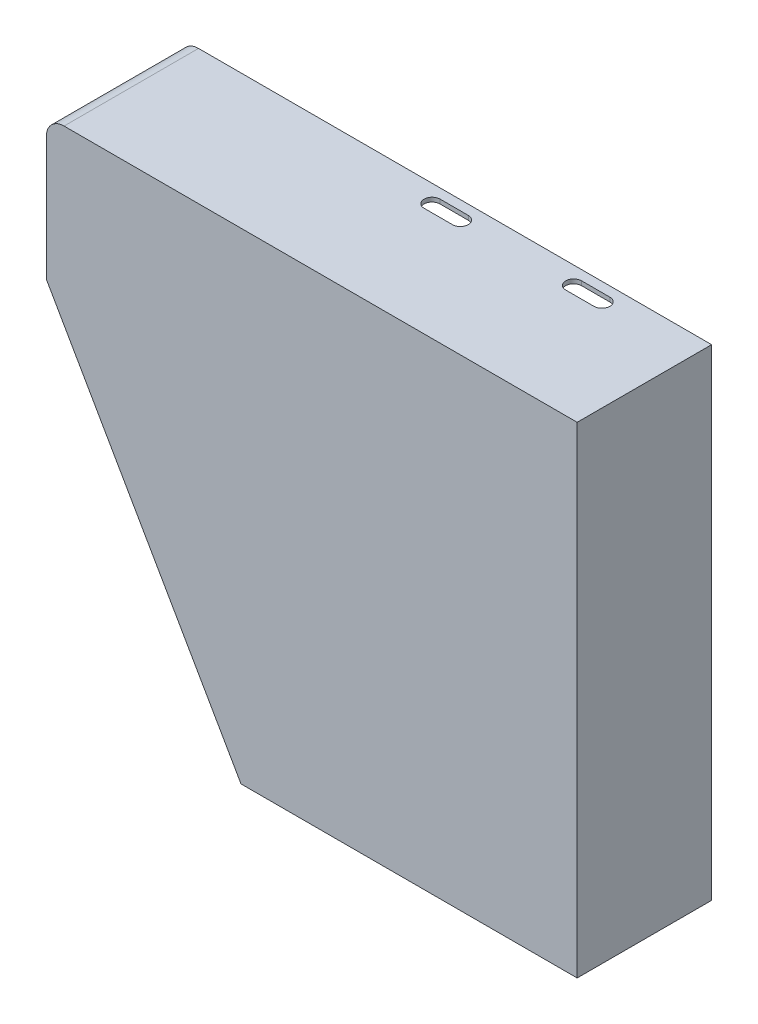
ISO-10303-21;
HEADER;
FILE_DESCRIPTION(('STEP AP214'),'2;1');
FILE_NAME('part.step','',(''),(''),'','','');
FILE_SCHEMA(('AUTOMOTIVE_DESIGN { 1 0 10303 214 1 1 1 1 }'));
ENDSEC;
DATA;
#1=APPLICATION_CONTEXT('core data for automotive mechanical design processes');
#2=APPLICATION_PROTOCOL_DEFINITION('international standard','automotive_design',2000,#1);
#3=PRODUCT_CONTEXT('',#1,'mechanical');
#4=PRODUCT('Part','Part','',(#3));
#5=PRODUCT_RELATED_PRODUCT_CATEGORY('part','',(#4));
#6=PRODUCT_DEFINITION_FORMATION('','',#4);
#7=PRODUCT_DEFINITION_CONTEXT('part definition',#1,'design');
#8=PRODUCT_DEFINITION('design','',#6,#7);
#9=PRODUCT_DEFINITION_SHAPE('','',#8);
#10=(LENGTH_UNIT() NAMED_UNIT(*) SI_UNIT(.MILLI.,.METRE.));
#11=(NAMED_UNIT(*) PLANE_ANGLE_UNIT() SI_UNIT($,.RADIAN.));
#12=(NAMED_UNIT(*) SI_UNIT($,.STERADIAN.) SOLID_ANGLE_UNIT());
#13=UNCERTAINTY_MEASURE_WITH_UNIT(LENGTH_MEASURE(1.E-05),#10,'distance_accuracy_value','');
#14=(GEOMETRIC_REPRESENTATION_CONTEXT(3) GLOBAL_UNCERTAINTY_ASSIGNED_CONTEXT((#13)) GLOBAL_UNIT_ASSIGNED_CONTEXT((#10,
#11,#12)) REPRESENTATION_CONTEXT('',''));
#15=CARTESIAN_POINT('',(0.,0.,0.));
#16=DIRECTION('',(0.,0.,1.));
#17=DIRECTION('',(1.,0.,0.));
#18=AXIS2_PLACEMENT_3D('',#15,#16,#17);
#19=CARTESIAN_POINT('',(-149.999999999999,95.9999999999752,38.));
#20=DIRECTION('',(1.,0.,0.));
#21=DIRECTION('',(0.,0.,-1.));
#22=AXIS2_PLACEMENT_3D('',#19,#20,#21);
#23=PLANE('',#22);
#24=DIRECTION('',(0.,-1.,0.));
#25=VECTOR('',#24,1.);
#26=CARTESIAN_POINT('',(-149.999999999999,95.9999999999752,0.));
#27=LINE('',#26,#25);
#28=CARTESIAN_POINT('',(-149.999999999999,130.999999999958,0.));
#29=VERTEX_POINT('',#28);
#30=CARTESIAN_POINT('',(-149.999999999999,95.9999999999752,0.));
#31=VERTEX_POINT('',#30);
#32=EDGE_CURVE('E249',#29,#31,#27,.T.);
#33=ORIENTED_EDGE('',*,*,#32,.T.);
#34=DIRECTION('',(0.,0.,-1.));
#35=VECTOR('',#34,1.);
#36=CARTESIAN_POINT('',(-149.999999999999,95.9999999999752,38.));
#37=LINE('',#36,#35);
#38=CARTESIAN_POINT('',(-149.999999999999,95.9999999999752,38.));
#39=VERTEX_POINT('',#38);
#40=EDGE_CURVE('E332',#39,#31,#37,.T.);
#41=ORIENTED_EDGE('',*,*,#40,.F.);
#42=DIRECTION('',(0.,-1.,0.));
#43=VECTOR('',#42,1.);
#44=CARTESIAN_POINT('',(-149.999999999999,95.9999999999752,38.));
#45=LINE('',#44,#43);
#46=CARTESIAN_POINT('',(-149.999999999999,130.999999999958,38.));
#47=VERTEX_POINT('',#46);
#48=EDGE_CURVE('E292',#47,#39,#45,.T.);
#49=ORIENTED_EDGE('',*,*,#48,.F.);
#50=DIRECTION('',(0.,0.,-1.));
#51=VECTOR('',#50,1.);
#52=CARTESIAN_POINT('',(-149.999999999999,130.999999999958,38.));
#53=LINE('',#52,#51);
#54=EDGE_CURVE('E306',#47,#29,#53,.T.);
#55=ORIENTED_EDGE('',*,*,#54,.T.);
#56=EDGE_LOOP('',(#33,#41,#49,#55));
#57=FACE_BOUND('',#56,.T.);
#58=ADVANCED_FACE('F35',(#57),#23,.F.);
#59=CARTESIAN_POINT('',(-149.999999999999,95.9999999999752,38.));
#60=DIRECTION('',(0.867686387293144,0.497111992720124,0.));
#61=DIRECTION('',(-0.497111992720124,0.867686387293144,0.));
#62=AXIS2_PLACEMENT_3D('',#59,#60,#61);
#63=PLANE('',#62);
#64=DIRECTION('',(0.497111992720124,-0.867686387293144,0.));
#65=VECTOR('',#64,1.);
#66=CARTESIAN_POINT('',(-149.999999999999,95.9999999999752,0.));
#67=LINE('',#66,#65);
#68=CARTESIAN_POINT('',(-95.0000000000024,0.,0.));
#69=VERTEX_POINT('',#68);
#70=EDGE_CURVE('E309',#31,#69,#67,.T.);
#71=ORIENTED_EDGE('',*,*,#70,.T.);
#72=DIRECTION('',(0.,0.,-1.));
#73=VECTOR('',#72,1.);
#74=CARTESIAN_POINT('',(-95.0000000000024,0.,38.));
#75=LINE('',#74,#73);
#76=CARTESIAN_POINT('',(-95.0000000000024,0.,38.));
#77=VERTEX_POINT('',#76);
#78=EDGE_CURVE('E329',#77,#69,#75,.T.);
#79=ORIENTED_EDGE('',*,*,#78,.F.);
#80=DIRECTION('',(0.497111992720124,-0.867686387293144,0.));
#81=VECTOR('',#80,1.);
#82=CARTESIAN_POINT('',(-149.999999999999,95.9999999999752,38.));
#83=LINE('',#82,#81);
#84=EDGE_CURVE('E295',#39,#77,#83,.T.);
#85=ORIENTED_EDGE('',*,*,#84,.F.);
#86=ORIENTED_EDGE('',*,*,#40,.T.);
#87=EDGE_LOOP('',(#71,#79,#85,#86));
#88=FACE_BOUND('',#87,.T.);
#89=ADVANCED_FACE('F496',(#88),#63,.F.);
#90=CARTESIAN_POINT('',(0.,0.,38.));
#91=DIRECTION('',(0.,1.,0.));
#92=DIRECTION('',(0.,0.,1.));
#93=AXIS2_PLACEMENT_3D('',#90,#91,#92);
#94=PLANE('',#93);
#95=CARTESIAN_POINT('',(-74.0000000000052,0.,4.99999999999901));
#96=DIRECTION('',(0.,-1.,0.));
#97=DIRECTION('',(0.,0.,-1.));
#98=AXIS2_PLACEMENT_3D('',#95,#96,#97);
#99=CIRCLE('',#98,2.25000000000009);
#100=CARTESIAN_POINT('',(-74.0000000000052,0.,7.24999999999909));
#101=VERTEX_POINT('',#100);
#102=CARTESIAN_POINT('',(-74.0000000000052,0.,2.74999999999892));
#103=VERTEX_POINT('',#102);
#104=EDGE_CURVE('E238',#101,#103,#99,.T.);
#105=ORIENTED_EDGE('',*,*,#104,.F.);
#106=DIRECTION('',(1.,0.,0.));
#107=VECTOR('',#106,1.);
#108=CARTESIAN_POINT('',(0.,0.,7.24999999999909));
#109=LINE('',#108,#107);
#110=CARTESIAN_POINT('',(-65.9999999999954,0.,7.24999999999909));
#111=VERTEX_POINT('',#110);
#112=EDGE_CURVE('E38',#111,#101,#109,.F.);
#113=ORIENTED_EDGE('',*,*,#112,.F.);
#114=CARTESIAN_POINT('',(-65.9999999999954,0.,4.99999999999901));
#115=DIRECTION('',(0.,-1.,0.));
#116=DIRECTION('',(0.,0.,-1.));
#117=AXIS2_PLACEMENT_3D('',#114,#115,#116);
#118=CIRCLE('',#117,2.25000000000009);
#119=CARTESIAN_POINT('',(-65.9999999999954,0.,2.74999999999892));
#120=VERTEX_POINT('',#119);
#121=EDGE_CURVE('E85',#120,#111,#118,.T.);
#122=ORIENTED_EDGE('',*,*,#121,.F.);
#123=DIRECTION('',(-1.,0.,0.));
#124=VECTOR('',#123,1.);
#125=CARTESIAN_POINT('',(0.,0.,2.74999999999892));
#126=LINE('',#125,#124);
#127=EDGE_CURVE('E223',#103,#120,#126,.F.);
#128=ORIENTED_EDGE('',*,*,#127,.F.);
#129=EDGE_LOOP('',(#105,#113,#122,#128));
#130=FACE_BOUND('',#129,.T.);
#131=CARTESIAN_POINT('',(-33.9999999999989,0.,4.99999999999901));
#132=DIRECTION('',(0.,-1.,0.));
#133=DIRECTION('',(0.,0.,-1.));
#134=AXIS2_PLACEMENT_3D('',#131,#132,#133);
#135=CIRCLE('',#134,2.25000000000009);
#136=CARTESIAN_POINT('',(-33.9999999999989,0.,7.24999999999909));
#137=VERTEX_POINT('',#136);
#138=CARTESIAN_POINT('',(-33.9999999999989,0.,2.74999999999892));
#139=VERTEX_POINT('',#138);
#140=EDGE_CURVE('E350',#137,#139,#135,.T.);
#141=ORIENTED_EDGE('',*,*,#140,.F.);
#142=DIRECTION('',(1.,0.,0.));
#143=VECTOR('',#142,1.);
#144=CARTESIAN_POINT('',(0.,0.,7.24999999999909));
#145=LINE('',#144,#143);
#146=CARTESIAN_POINT('',(-26.0000000000034,0.,7.24999999999909));
#147=VERTEX_POINT('',#146);
#148=EDGE_CURVE('E359',#147,#137,#145,.F.);
#149=ORIENTED_EDGE('',*,*,#148,.F.);
#150=CARTESIAN_POINT('',(-26.0000000000034,0.,4.99999999999901));
#151=DIRECTION('',(0.,-1.,0.));
#152=DIRECTION('',(0.,0.,-1.));
#153=AXIS2_PLACEMENT_3D('',#150,#151,#152);
#154=CIRCLE('',#153,2.25000000000009);
#155=CARTESIAN_POINT('',(-26.0000000000034,0.,2.74999999999892));
#156=VERTEX_POINT('',#155);
#157=EDGE_CURVE('E355',#156,#147,#154,.T.);
#158=ORIENTED_EDGE('',*,*,#157,.F.);
#159=DIRECTION('',(-1.,0.,0.));
#160=VECTOR('',#159,1.);
#161=CARTESIAN_POINT('',(0.,0.,2.74999999999892));
#162=LINE('',#161,#160);
#163=EDGE_CURVE('E192',#139,#156,#162,.F.);
#164=ORIENTED_EDGE('',*,*,#163,.F.);
#165=EDGE_LOOP('',(#141,#149,#158,#164));
#166=FACE_BOUND('',#165,.T.);
#167=DIRECTION('',(1.,0.,0.));
#168=VECTOR('',#167,1.);
#169=CARTESIAN_POINT('',(0.,0.,0.));
#170=LINE('',#169,#168);
#171=CARTESIAN_POINT('',(0.,0.,0.));
#172=VERTEX_POINT('',#171);
#173=EDGE_CURVE('E311',#69,#172,#170,.T.);
#174=ORIENTED_EDGE('',*,*,#173,.T.);
#175=DIRECTION('',(0.,0.,-1.));
#176=VECTOR('',#175,1.);
#177=CARTESIAN_POINT('',(0.,0.,38.));
#178=LINE('',#177,#176);
#179=CARTESIAN_POINT('',(0.,0.,38.));
#180=VERTEX_POINT('',#179);
#181=EDGE_CURVE('E326',#180,#172,#178,.T.);
#182=ORIENTED_EDGE('',*,*,#181,.F.);
#183=DIRECTION('',(1.,0.,0.));
#184=VECTOR('',#183,1.);
#185=CARTESIAN_POINT('',(0.,0.,38.));
#186=LINE('',#185,#184);
#187=EDGE_CURVE('E298',#77,#180,#186,.T.);
#188=ORIENTED_EDGE('',*,*,#187,.F.);
#189=ORIENTED_EDGE('',*,*,#78,.T.);
#190=EDGE_LOOP('',(#174,#182,#188,#189));
#191=FACE_BOUND('',#190,.T.);
#192=ADVANCED_FACE('F494',(#130,#166,#191),#94,.F.);
#193=CARTESIAN_POINT('',(0.,135.99999999996,38.));
#194=DIRECTION('',(-1.,0.,0.));
#195=DIRECTION('',(0.,0.,1.));
#196=AXIS2_PLACEMENT_3D('',#193,#194,#195);
#197=PLANE('',#196);
#198=DIRECTION('',(0.,1.,0.));
#199=VECTOR('',#198,1.);
#200=CARTESIAN_POINT('',(0.,135.99999999996,0.));
#201=LINE('',#200,#199);
#202=CARTESIAN_POINT('',(0.,135.99999999996,0.));
#203=VERTEX_POINT('',#202);
#204=EDGE_CURVE('E313',#172,#203,#201,.T.);
#205=ORIENTED_EDGE('',*,*,#204,.T.);
#206=DIRECTION('',(0.,0.,-1.));
#207=VECTOR('',#206,1.);
#208=CARTESIAN_POINT('',(0.,135.99999999996,38.));
#209=LINE('',#208,#207);
#210=CARTESIAN_POINT('',(0.,135.99999999996,38.));
#211=VERTEX_POINT('',#210);
#212=EDGE_CURVE('E323',#211,#203,#209,.T.);
#213=ORIENTED_EDGE('',*,*,#212,.F.);
#214=DIRECTION('',(0.,1.,0.));
#215=VECTOR('',#214,1.);
#216=CARTESIAN_POINT('',(0.,135.99999999996,38.));
#217=LINE('',#216,#215);
#218=EDGE_CURVE('E300',#180,#211,#217,.T.);
#219=ORIENTED_EDGE('',*,*,#218,.F.);
#220=ORIENTED_EDGE('',*,*,#181,.T.);
#221=EDGE_LOOP('',(#205,#213,#219,#220));
#222=FACE_BOUND('',#221,.T.);
#223=ADVANCED_FACE('F468',(#222),#197,.F.);
#224=CARTESIAN_POINT('',(-144.999999999996,135.99999999996,38.));
#225=DIRECTION('',(0.,-1.,0.));
#226=DIRECTION('',(0.,0.,-1.));
#227=AXIS2_PLACEMENT_3D('',#224,#225,#226);
#228=PLANE('',#227);
#229=CARTESIAN_POINT('',(-65.9999999999954,135.99999999996,4.99999999999901));
#230=DIRECTION('',(0.,-1.,0.));
#231=DIRECTION('',(0.,0.,-1.));
#232=AXIS2_PLACEMENT_3D('',#229,#230,#231);
#233=CIRCLE('',#232,2.25000000000009);
#234=CARTESIAN_POINT('',(-65.9999999999954,135.99999999996,2.74999999999892));
#235=VERTEX_POINT('',#234);
#236=CARTESIAN_POINT('',(-65.9999999999954,135.99999999996,7.24999999999909));
#237=VERTEX_POINT('',#236);
#238=EDGE_CURVE('E406',#235,#237,#233,.T.);
#239=ORIENTED_EDGE('',*,*,#238,.T.);
#240=DIRECTION('',(-1.,0.,0.));
#241=VECTOR('',#240,1.);
#242=CARTESIAN_POINT('',(0.,135.99999999996,7.24999999999909));
#243=LINE('',#242,#241);
#244=CARTESIAN_POINT('',(-74.0000000000052,135.99999999996,7.24999999999909));
#245=VERTEX_POINT('',#244);
#246=EDGE_CURVE('E381',#237,#245,#243,.T.);
#247=ORIENTED_EDGE('',*,*,#246,.T.);
#248=CARTESIAN_POINT('',(-74.0000000000052,135.99999999996,4.99999999999901));
#249=DIRECTION('',(0.,-1.,0.));
#250=DIRECTION('',(0.,0.,-1.));
#251=AXIS2_PLACEMENT_3D('',#248,#249,#250);
#252=CIRCLE('',#251,2.25000000000009);
#253=CARTESIAN_POINT('',(-74.0000000000052,135.99999999996,2.74999999999892));
#254=VERTEX_POINT('',#253);
#255=EDGE_CURVE('E412',#245,#254,#252,.T.);
#256=ORIENTED_EDGE('',*,*,#255,.T.);
#257=DIRECTION('',(1.,0.,0.));
#258=VECTOR('',#257,1.);
#259=CARTESIAN_POINT('',(0.,135.99999999996,2.74999999999892));
#260=LINE('',#259,#258);
#261=EDGE_CURVE('E409',#254,#235,#260,.T.);
#262=ORIENTED_EDGE('',*,*,#261,.T.);
#263=EDGE_LOOP('',(#239,#247,#256,#262));
#264=FACE_BOUND('',#263,.T.);
#265=CARTESIAN_POINT('',(-26.0000000000034,135.99999999996,4.99999999999901));
#266=DIRECTION('',(0.,-1.,0.));
#267=DIRECTION('',(0.,0.,-1.));
#268=AXIS2_PLACEMENT_3D('',#265,#266,#267);
#269=CIRCLE('',#268,2.25000000000009);
#270=CARTESIAN_POINT('',(-26.0000000000034,135.99999999996,2.74999999999892));
#271=VERTEX_POINT('',#270);
#272=CARTESIAN_POINT('',(-26.0000000000034,135.99999999996,7.24999999999909));
#273=VERTEX_POINT('',#272);
#274=EDGE_CURVE('E386',#271,#273,#269,.T.);
#275=ORIENTED_EDGE('',*,*,#274,.T.);
#276=DIRECTION('',(-1.,0.,0.));
#277=VECTOR('',#276,1.);
#278=CARTESIAN_POINT('',(0.,135.99999999996,7.24999999999909));
#279=LINE('',#278,#277);
#280=CARTESIAN_POINT('',(-33.9999999999989,135.99999999996,7.24999999999909));
#281=VERTEX_POINT('',#280);
#282=EDGE_CURVE('E395',#273,#281,#279,.T.);
#283=ORIENTED_EDGE('',*,*,#282,.T.);
#284=CARTESIAN_POINT('',(-33.9999999999989,135.99999999996,4.99999999999901));
#285=DIRECTION('',(0.,-1.,0.));
#286=DIRECTION('',(0.,0.,-1.));
#287=AXIS2_PLACEMENT_3D('',#284,#285,#286);
#288=CIRCLE('',#287,2.25000000000009);
#289=CARTESIAN_POINT('',(-33.9999999999989,135.99999999996,2.74999999999892));
#290=VERTEX_POINT('',#289);
#291=EDGE_CURVE('E392',#281,#290,#288,.T.);
#292=ORIENTED_EDGE('',*,*,#291,.T.);
#293=DIRECTION('',(1.,0.,0.));
#294=VECTOR('',#293,1.);
#295=CARTESIAN_POINT('',(0.,135.99999999996,2.74999999999892));
#296=LINE('',#295,#294);
#297=EDGE_CURVE('E389',#290,#271,#296,.T.);
#298=ORIENTED_EDGE('',*,*,#297,.T.);
#299=EDGE_LOOP('',(#275,#283,#292,#298));
#300=FACE_BOUND('',#299,.T.);
#301=DIRECTION('',(-1.,0.,0.));
#302=VECTOR('',#301,1.);
#303=CARTESIAN_POINT('',(-144.999999999996,135.99999999996,0.));
#304=LINE('',#303,#302);
#305=CARTESIAN_POINT('',(-144.999999999996,135.99999999996,0.));
#306=VERTEX_POINT('',#305);
#307=EDGE_CURVE('E315',#203,#306,#304,.T.);
#308=ORIENTED_EDGE('',*,*,#307,.T.);
#309=DIRECTION('',(0.,0.,-1.));
#310=VECTOR('',#309,1.);
#311=CARTESIAN_POINT('',(-144.999999999996,135.99999999996,38.));
#312=LINE('',#311,#310);
#313=CARTESIAN_POINT('',(-144.999999999996,135.99999999996,38.));
#314=VERTEX_POINT('',#313);
#315=EDGE_CURVE('E320',#314,#306,#312,.T.);
#316=ORIENTED_EDGE('',*,*,#315,.F.);
#317=DIRECTION('',(-1.,0.,0.));
#318=VECTOR('',#317,1.);
#319=CARTESIAN_POINT('',(-144.999999999996,135.99999999996,38.));
#320=LINE('',#319,#318);
#321=EDGE_CURVE('E302',#211,#314,#320,.T.);
#322=ORIENTED_EDGE('',*,*,#321,.F.);
#323=ORIENTED_EDGE('',*,*,#212,.T.);
#324=EDGE_LOOP('',(#308,#316,#322,#323));
#325=FACE_BOUND('',#324,.T.);
#326=ADVANCED_FACE('F419',(#264,#300,#325),#228,.F.);
#327=CARTESIAN_POINT('',(-144.999999999996,130.999999999958,38.));
#328=DIRECTION('',(0.,0.,-1.));
#329=DIRECTION('',(-1.,0.,0.));
#330=AXIS2_PLACEMENT_3D('',#327,#328,#329);
#331=CYLINDRICAL_SURFACE('',#330,5.00000000000256);
#332=CARTESIAN_POINT('',(-144.999999999996,130.999999999958,0.));
#333=DIRECTION('',(0.,0.,1.));
#334=DIRECTION('',(1.,0.,0.));
#335=AXIS2_PLACEMENT_3D('',#332,#333,#334);
#336=CIRCLE('',#335,5.00000000000256);
#337=EDGE_CURVE('E296',#306,#29,#336,.T.);
#338=ORIENTED_EDGE('',*,*,#337,.T.);
#339=ORIENTED_EDGE('',*,*,#54,.F.);
#340=CARTESIAN_POINT('',(-144.999999999996,130.999999999958,38.));
#341=DIRECTION('',(0.,0.,1.));
#342=DIRECTION('',(1.,0.,0.));
#343=AXIS2_PLACEMENT_3D('',#340,#341,#342);
#344=CIRCLE('',#343,5.00000000000256);
#345=EDGE_CURVE('E304',#314,#47,#344,.T.);
#346=ORIENTED_EDGE('',*,*,#345,.F.);
#347=ORIENTED_EDGE('',*,*,#315,.T.);
#348=EDGE_LOOP('',(#338,#339,#346,#347));
#349=FACE_BOUND('',#348,.T.);
#350=ADVANCED_FACE('F467',(#349),#331,.T.);
#351=CARTESIAN_POINT('',(-144.999999999996,130.999999999958,38.));
#352=DIRECTION('',(0.,0.,1.));
#353=DIRECTION('',(1.,0.,0.));
#354=AXIS2_PLACEMENT_3D('',#351,#352,#353);
#355=PLANE('',#354);
#356=ORIENTED_EDGE('',*,*,#48,.T.);
#357=ORIENTED_EDGE('',*,*,#84,.T.);
#358=ORIENTED_EDGE('',*,*,#187,.T.);
#359=ORIENTED_EDGE('',*,*,#218,.T.);
#360=ORIENTED_EDGE('',*,*,#321,.T.);
#361=ORIENTED_EDGE('',*,*,#345,.T.);
#362=EDGE_LOOP('',(#356,#357,#358,#359,#360,#361));
#363=FACE_BOUND('',#362,.T.);
#364=ADVANCED_FACE('F487',(#363),#355,.T.);
#365=CARTESIAN_POINT('',(-144.999999999996,130.999999999958,0.));
#366=DIRECTION('',(0.,0.,1.));
#367=DIRECTION('',(1.,0.,0.));
#368=AXIS2_PLACEMENT_3D('',#365,#366,#367);
#369=PLANE('',#368);
#370=CARTESIAN_POINT('',(-144.999999999996,130.999999999958,0.));
#371=DIRECTION('',(0.,0.,1.));
#372=DIRECTION('',(1.,0.,0.));
#373=AXIS2_PLACEMENT_3D('',#370,#371,#372);
#374=CIRCLE('',#373,3.80000000000256);
#375=CARTESIAN_POINT('',(-144.999999999996,134.79999999996,0.));
#376=VERTEX_POINT('',#375);
#377=CARTESIAN_POINT('',(-148.799999999999,130.999999999958,0.));
#378=VERTEX_POINT('',#377);
#379=EDGE_CURVE('E255',#376,#378,#374,.T.);
#380=ORIENTED_EDGE('',*,*,#379,.T.);
#381=DIRECTION('',(0.,-1.,0.));
#382=VECTOR('',#381,1.);
#383=CARTESIAN_POINT('',(-148.799999999999,95.9999999999752,0.));
#384=LINE('',#383,#382);
#385=CARTESIAN_POINT('',(-148.799999999999,96.3193975151697,0.));
#386=VERTEX_POINT('',#385);
#387=EDGE_CURVE('E275',#378,#386,#384,.T.);
#388=ORIENTED_EDGE('',*,*,#387,.T.);
#389=DIRECTION('',(0.497111992720124,-0.867686387293144,0.));
#390=VECTOR('',#389,1.);
#391=CARTESIAN_POINT('',(-148.958776335247,96.5965343912394,0.));
#392=LINE('',#391,#390);
#393=CARTESIAN_POINT('',(-94.3045118402556,1.2,0.));
#394=VERTEX_POINT('',#393);
#395=EDGE_CURVE('E278',#386,#394,#392,.T.);
#396=ORIENTED_EDGE('',*,*,#395,.T.);
#397=DIRECTION('',(1.,0.,0.));
#398=VECTOR('',#397,1.);
#399=CARTESIAN_POINT('',(0.,1.2,0.));
#400=LINE('',#399,#398);
#401=CARTESIAN_POINT('',(-1.2,1.2,0.));
#402=VERTEX_POINT('',#401);
#403=EDGE_CURVE('E287',#394,#402,#400,.T.);
#404=ORIENTED_EDGE('',*,*,#403,.T.);
#405=DIRECTION('',(0.,1.,0.));
#406=VECTOR('',#405,1.);
#407=CARTESIAN_POINT('',(-1.2,135.99999999996,0.));
#408=LINE('',#407,#406);
#409=CARTESIAN_POINT('',(-1.2,134.79999999996,0.));
#410=VERTEX_POINT('',#409);
#411=EDGE_CURVE('E284',#402,#410,#408,.T.);
#412=ORIENTED_EDGE('',*,*,#411,.T.);
#413=DIRECTION('',(-1.,0.,0.));
#414=VECTOR('',#413,1.);
#415=CARTESIAN_POINT('',(-144.999999999996,134.79999999996,0.));
#416=LINE('',#415,#414);
#417=EDGE_CURVE('E281',#410,#376,#416,.T.);
#418=ORIENTED_EDGE('',*,*,#417,.T.);
#419=EDGE_LOOP('',(#380,#388,#396,#404,#412,#418));
#420=FACE_BOUND('',#419,.T.);
#421=ORIENTED_EDGE('',*,*,#32,.F.);
#422=ORIENTED_EDGE('',*,*,#337,.F.);
#423=ORIENTED_EDGE('',*,*,#307,.F.);
#424=ORIENTED_EDGE('',*,*,#204,.F.);
#425=ORIENTED_EDGE('',*,*,#173,.F.);
#426=ORIENTED_EDGE('',*,*,#70,.F.);
#427=EDGE_LOOP('',(#421,#422,#423,#424,#425,#426));
#428=FACE_BOUND('',#427,.T.);
#429=ADVANCED_FACE('F481',(#420,#428),#369,.F.);
#430=CARTESIAN_POINT('',(-148.799999999999,95.9999999999752,38.));
#431=DIRECTION('',(1.,0.,0.));
#432=DIRECTION('',(0.,0.,-1.));
#433=AXIS2_PLACEMENT_3D('',#430,#431,#432);
#434=PLANE('',#433);
#435=ORIENTED_EDGE('',*,*,#387,.F.);
#436=DIRECTION('',(0.,0.,-1.));
#437=VECTOR('',#436,1.);
#438=CARTESIAN_POINT('',(-148.799999999999,130.999999999958,38.));
#439=LINE('',#438,#437);
#440=CARTESIAN_POINT('',(-148.799999999999,130.999999999958,36.8));
#441=VERTEX_POINT('',#440);
#442=EDGE_CURVE('E256',#441,#378,#439,.T.);
#443=ORIENTED_EDGE('',*,*,#442,.F.);
#444=DIRECTION('',(0.,-1.,0.));
#445=VECTOR('',#444,1.);
#446=CARTESIAN_POINT('',(-148.799999999999,95.9999999999752,36.8));
#447=LINE('',#446,#445);
#448=CARTESIAN_POINT('',(-148.799999999999,96.3193975151697,36.8));
#449=VERTEX_POINT('',#448);
#450=EDGE_CURVE('E251',#441,#449,#447,.T.);
#451=ORIENTED_EDGE('',*,*,#450,.T.);
#452=DIRECTION('',(0.,0.,-1.));
#453=VECTOR('',#452,1.);
#454=CARTESIAN_POINT('',(-148.799999999999,96.3193975151697,38.));
#455=LINE('',#454,#453);
#456=EDGE_CURVE('E246',#449,#386,#455,.T.);
#457=ORIENTED_EDGE('',*,*,#456,.T.);
#458=EDGE_LOOP('',(#435,#443,#451,#457));
#459=FACE_BOUND('',#458,.T.);
#460=ADVANCED_FACE('F511',(#459),#434,.T.);
#461=CARTESIAN_POINT('',(-148.958776335247,96.5965343912394,38.));
#462=DIRECTION('',(0.867686387293144,0.497111992720124,0.));
#463=DIRECTION('',(-0.497111992720124,0.867686387293144,0.));
#464=AXIS2_PLACEMENT_3D('',#461,#462,#463);
#465=PLANE('',#464);
#466=ORIENTED_EDGE('',*,*,#395,.F.);
#467=ORIENTED_EDGE('',*,*,#456,.F.);
#468=DIRECTION('',(0.497111992720124,-0.867686387293144,0.));
#469=VECTOR('',#468,1.);
#470=CARTESIAN_POINT('',(-148.958776335247,96.5965343912394,36.8));
#471=LINE('',#470,#469);
#472=CARTESIAN_POINT('',(-94.3045118402556,1.2,36.8));
#473=VERTEX_POINT('',#472);
#474=EDGE_CURVE('E254',#449,#473,#471,.T.);
#475=ORIENTED_EDGE('',*,*,#474,.T.);
#476=DIRECTION('',(0.,0.,-1.));
#477=VECTOR('',#476,1.);
#478=CARTESIAN_POINT('',(-94.3045118402556,1.2,38.));
#479=LINE('',#478,#477);
#480=EDGE_CURVE('E250',#473,#394,#479,.T.);
#481=ORIENTED_EDGE('',*,*,#480,.T.);
#482=EDGE_LOOP('',(#466,#467,#475,#481));
#483=FACE_BOUND('',#482,.T.);
#484=ADVANCED_FACE('F532',(#483),#465,.T.);
#485=CARTESIAN_POINT('',(0.,1.2,38.));
#486=DIRECTION('',(0.,1.,0.));
#487=DIRECTION('',(0.,0.,1.));
#488=AXIS2_PLACEMENT_3D('',#485,#486,#487);
#489=PLANE('',#488);
#490=DIRECTION('',(1.,0.,0.));
#491=VECTOR('',#490,1.);
#492=CARTESIAN_POINT('',(0.,1.2,7.24999999999909));
#493=LINE('',#492,#491);
#494=CARTESIAN_POINT('',(-74.0000000000052,1.20000000000001,7.24999999999909));
#495=VERTEX_POINT('',#494);
#496=CARTESIAN_POINT('',(-65.9999999999954,1.20000000000001,7.24999999999909));
#497=VERTEX_POINT('',#496);
#498=EDGE_CURVE('E94',#495,#497,#493,.T.);
#499=ORIENTED_EDGE('',*,*,#498,.F.);
#500=CARTESIAN_POINT('',(-74.0000000000052,1.20000000000001,4.99999999999901));
#501=DIRECTION('',(0.,1.,0.));
#502=DIRECTION('',(0.,0.,1.));
#503=AXIS2_PLACEMENT_3D('',#500,#501,#502);
#504=CIRCLE('',#503,2.25000000000009);
#505=CARTESIAN_POINT('',(-74.0000000000052,1.20000000000001,2.74999999999892));
#506=VERTEX_POINT('',#505);
#507=EDGE_CURVE('E237',#506,#495,#504,.T.);
#508=ORIENTED_EDGE('',*,*,#507,.F.);
#509=DIRECTION('',(-1.,0.,0.));
#510=VECTOR('',#509,1.);
#511=CARTESIAN_POINT('',(0.,1.2,2.74999999999892));
#512=LINE('',#511,#510);
#513=CARTESIAN_POINT('',(-65.9999999999954,1.20000000000001,2.74999999999892));
#514=VERTEX_POINT('',#513);
#515=EDGE_CURVE('E229',#514,#506,#512,.T.);
#516=ORIENTED_EDGE('',*,*,#515,.F.);
#517=CARTESIAN_POINT('',(-65.9999999999954,1.20000000000001,4.99999999999901));
#518=DIRECTION('',(0.,1.,0.));
#519=DIRECTION('',(0.,0.,1.));
#520=AXIS2_PLACEMENT_3D('',#517,#518,#519);
#521=CIRCLE('',#520,2.25000000000009);
#522=EDGE_CURVE('E216',#497,#514,#521,.T.);
#523=ORIENTED_EDGE('',*,*,#522,.F.);
#524=EDGE_LOOP('',(#499,#508,#516,#523));
#525=FACE_BOUND('',#524,.T.);
#526=DIRECTION('',(1.,0.,0.));
#527=VECTOR('',#526,1.);
#528=CARTESIAN_POINT('',(0.,1.2,7.24999999999909));
#529=LINE('',#528,#527);
#530=CARTESIAN_POINT('',(-33.9999999999989,1.20000000000001,7.24999999999909));
#531=VERTEX_POINT('',#530);
#532=CARTESIAN_POINT('',(-26.0000000000034,1.20000000000001,7.24999999999909));
#533=VERTEX_POINT('',#532);
#534=EDGE_CURVE('E358',#531,#533,#529,.T.);
#535=ORIENTED_EDGE('',*,*,#534,.F.);
#536=CARTESIAN_POINT('',(-33.9999999999989,1.20000000000001,4.99999999999901));
#537=DIRECTION('',(0.,1.,0.));
#538=DIRECTION('',(0.,0.,1.));
#539=AXIS2_PLACEMENT_3D('',#536,#537,#538);
#540=CIRCLE('',#539,2.25000000000009);
#541=CARTESIAN_POINT('',(-33.9999999999989,1.20000000000001,2.74999999999892));
#542=VERTEX_POINT('',#541);
#543=EDGE_CURVE('E353',#542,#531,#540,.T.);
#544=ORIENTED_EDGE('',*,*,#543,.F.);
#545=DIRECTION('',(-1.,0.,0.));
#546=VECTOR('',#545,1.);
#547=CARTESIAN_POINT('',(0.,1.2,2.74999999999892));
#548=LINE('',#547,#546);
#549=CARTESIAN_POINT('',(-26.0000000000034,1.20000000000001,2.74999999999892));
#550=VERTEX_POINT('',#549);
#551=EDGE_CURVE('E352',#550,#542,#548,.T.);
#552=ORIENTED_EDGE('',*,*,#551,.F.);
#553=CARTESIAN_POINT('',(-26.0000000000034,1.20000000000001,4.99999999999901));
#554=DIRECTION('',(0.,1.,0.));
#555=DIRECTION('',(0.,0.,1.));
#556=AXIS2_PLACEMENT_3D('',#553,#554,#555);
#557=CIRCLE('',#556,2.25000000000009);
#558=EDGE_CURVE('E202',#533,#550,#557,.T.);
#559=ORIENTED_EDGE('',*,*,#558,.F.);
#560=EDGE_LOOP('',(#535,#544,#552,#559));
#561=FACE_BOUND('',#560,.T.);
#562=ORIENTED_EDGE('',*,*,#403,.F.);
#563=ORIENTED_EDGE('',*,*,#480,.F.);
#564=DIRECTION('',(1.,0.,0.));
#565=VECTOR('',#564,1.);
#566=CARTESIAN_POINT('',(0.,1.2,36.8));
#567=LINE('',#566,#565);
#568=CARTESIAN_POINT('',(-1.2,1.2,36.8));
#569=VERTEX_POINT('',#568);
#570=EDGE_CURVE('E264',#473,#569,#567,.T.);
#571=ORIENTED_EDGE('',*,*,#570,.T.);
#572=DIRECTION('',(0.,0.,-1.));
#573=VECTOR('',#572,1.);
#574=CARTESIAN_POINT('',(-1.2,1.20000000000001,38.));
#575=LINE('',#574,#573);
#576=EDGE_CURVE('E262',#569,#402,#575,.T.);
#577=ORIENTED_EDGE('',*,*,#576,.T.);
#578=EDGE_LOOP('',(#562,#563,#571,#577));
#579=FACE_BOUND('',#578,.T.);
#580=ADVANCED_FACE('F235',(#525,#561,#579),#489,.T.);
#581=CARTESIAN_POINT('',(-1.2,135.99999999996,38.));
#582=DIRECTION('',(-1.,0.,0.));
#583=DIRECTION('',(0.,0.,1.));
#584=AXIS2_PLACEMENT_3D('',#581,#582,#583);
#585=PLANE('',#584);
#586=ORIENTED_EDGE('',*,*,#411,.F.);
#587=ORIENTED_EDGE('',*,*,#576,.F.);
#588=DIRECTION('',(0.,1.,0.));
#589=VECTOR('',#588,1.);
#590=CARTESIAN_POINT('',(-1.2,135.99999999996,36.8));
#591=LINE('',#590,#589);
#592=CARTESIAN_POINT('',(-1.2,134.79999999996,36.8));
#593=VERTEX_POINT('',#592);
#594=EDGE_CURVE('E268',#569,#593,#591,.T.);
#595=ORIENTED_EDGE('',*,*,#594,.T.);
#596=DIRECTION('',(0.,0.,-1.));
#597=VECTOR('',#596,1.);
#598=CARTESIAN_POINT('',(-1.20000000000001,134.79999999996,38.));
#599=LINE('',#598,#597);
#600=EDGE_CURVE('E266',#593,#410,#599,.T.);
#601=ORIENTED_EDGE('',*,*,#600,.T.);
#602=EDGE_LOOP('',(#586,#587,#595,#601));
#603=FACE_BOUND('',#602,.T.);
#604=ADVANCED_FACE('F525',(#603),#585,.T.);
#605=CARTESIAN_POINT('',(-144.999999999996,134.79999999996,38.));
#606=DIRECTION('',(0.,-1.,0.));
#607=DIRECTION('',(0.,0.,-1.));
#608=AXIS2_PLACEMENT_3D('',#605,#606,#607);
#609=PLANE('',#608);
#610=DIRECTION('',(-1.,0.,0.));
#611=VECTOR('',#610,1.);
#612=CARTESIAN_POINT('',(-144.999999999996,134.79999999996,7.24999999999909));
#613=LINE('',#612,#611);
#614=CARTESIAN_POINT('',(-65.9999999999954,134.79999999996,7.24999999999909));
#615=VERTEX_POINT('',#614);
#616=CARTESIAN_POINT('',(-74.0000000000052,134.79999999996,7.24999999999909));
#617=VERTEX_POINT('',#616);
#618=EDGE_CURVE('E11',#615,#617,#613,.T.);
#619=ORIENTED_EDGE('',*,*,#618,.F.);
#620=CARTESIAN_POINT('',(-65.9999999999954,134.79999999996,4.99999999999901));
#621=DIRECTION('',(0.,-1.,0.));
#622=DIRECTION('',(0.,0.,-1.));
#623=AXIS2_PLACEMENT_3D('',#620,#621,#622);
#624=CIRCLE('',#623,2.25000000000009);
#625=CARTESIAN_POINT('',(-65.9999999999954,134.79999999996,2.74999999999892));
#626=VERTEX_POINT('',#625);
#627=EDGE_CURVE('E43',#626,#615,#624,.T.);
#628=ORIENTED_EDGE('',*,*,#627,.F.);
#629=DIRECTION('',(1.,0.,0.));
#630=VECTOR('',#629,1.);
#631=CARTESIAN_POINT('',(-144.999999999996,134.79999999996,2.74999999999892));
#632=LINE('',#631,#630);
#633=CARTESIAN_POINT('',(-74.0000000000052,134.79999999996,2.74999999999892));
#634=VERTEX_POINT('',#633);
#635=EDGE_CURVE('E347',#634,#626,#632,.T.);
#636=ORIENTED_EDGE('',*,*,#635,.F.);
#637=CARTESIAN_POINT('',(-74.0000000000052,134.79999999996,4.99999999999901));
#638=DIRECTION('',(0.,-1.,0.));
#639=DIRECTION('',(0.,0.,-1.));
#640=AXIS2_PLACEMENT_3D('',#637,#638,#639);
#641=CIRCLE('',#640,2.25000000000009);
#642=EDGE_CURVE('E345',#617,#634,#641,.T.);
#643=ORIENTED_EDGE('',*,*,#642,.F.);
#644=EDGE_LOOP('',(#619,#628,#636,#643));
#645=FACE_BOUND('',#644,.T.);
#646=DIRECTION('',(-1.,0.,0.));
#647=VECTOR('',#646,1.);
#648=CARTESIAN_POINT('',(-144.999999999996,134.79999999996,7.24999999999909));
#649=LINE('',#648,#647);
#650=CARTESIAN_POINT('',(-26.0000000000034,134.79999999996,7.24999999999909));
#651=VERTEX_POINT('',#650);
#652=CARTESIAN_POINT('',(-33.9999999999989,134.79999999996,7.24999999999909));
#653=VERTEX_POINT('',#652);
#654=EDGE_CURVE('E342',#651,#653,#649,.T.);
#655=ORIENTED_EDGE('',*,*,#654,.F.);
#656=CARTESIAN_POINT('',(-26.0000000000034,134.79999999996,4.99999999999901));
#657=DIRECTION('',(0.,-1.,0.));
#658=DIRECTION('',(0.,0.,-1.));
#659=AXIS2_PLACEMENT_3D('',#656,#657,#658);
#660=CIRCLE('',#659,2.25000000000009);
#661=CARTESIAN_POINT('',(-26.0000000000034,134.79999999996,2.74999999999892));
#662=VERTEX_POINT('',#661);
#663=EDGE_CURVE('E340',#662,#651,#660,.T.);
#664=ORIENTED_EDGE('',*,*,#663,.F.);
#665=DIRECTION('',(1.,0.,0.));
#666=VECTOR('',#665,1.);
#667=CARTESIAN_POINT('',(-144.999999999996,134.79999999996,2.74999999999892));
#668=LINE('',#667,#666);
#669=CARTESIAN_POINT('',(-33.9999999999989,134.79999999996,2.74999999999892));
#670=VERTEX_POINT('',#669);
#671=EDGE_CURVE('E338',#670,#662,#668,.T.);
#672=ORIENTED_EDGE('',*,*,#671,.F.);
#673=CARTESIAN_POINT('',(-33.9999999999989,134.79999999996,4.99999999999901));
#674=DIRECTION('',(0.,-1.,0.));
#675=DIRECTION('',(0.,0.,-1.));
#676=AXIS2_PLACEMENT_3D('',#673,#674,#675);
#677=CIRCLE('',#676,2.25000000000009);
#678=EDGE_CURVE('E335',#653,#670,#677,.T.);
#679=ORIENTED_EDGE('',*,*,#678,.F.);
#680=EDGE_LOOP('',(#655,#664,#672,#679));
#681=FACE_BOUND('',#680,.T.);
#682=ORIENTED_EDGE('',*,*,#417,.F.);
#683=ORIENTED_EDGE('',*,*,#600,.F.);
#684=DIRECTION('',(-1.,0.,0.));
#685=VECTOR('',#684,1.);
#686=CARTESIAN_POINT('',(-144.999999999996,134.79999999996,36.8));
#687=LINE('',#686,#685);
#688=CARTESIAN_POINT('',(-144.999999999996,134.79999999996,36.8));
#689=VERTEX_POINT('',#688);
#690=EDGE_CURVE('E271',#593,#689,#687,.T.);
#691=ORIENTED_EDGE('',*,*,#690,.T.);
#692=DIRECTION('',(0.,0.,-1.));
#693=VECTOR('',#692,1.);
#694=CARTESIAN_POINT('',(-144.999999999996,134.79999999996,38.));
#695=LINE('',#694,#693);
#696=EDGE_CURVE('E258',#689,#376,#695,.T.);
#697=ORIENTED_EDGE('',*,*,#696,.T.);
#698=EDGE_LOOP('',(#682,#683,#691,#697));
#699=FACE_BOUND('',#698,.T.);
#700=ADVANCED_FACE('F457',(#645,#681,#699),#609,.T.);
#701=CARTESIAN_POINT('',(-144.999999999996,130.999999999958,38.));
#702=DIRECTION('',(0.,0.,-1.));
#703=DIRECTION('',(-1.,0.,0.));
#704=AXIS2_PLACEMENT_3D('',#701,#702,#703);
#705=CYLINDRICAL_SURFACE('',#704,3.80000000000256);
#706=ORIENTED_EDGE('',*,*,#379,.F.);
#707=ORIENTED_EDGE('',*,*,#696,.F.);
#708=CARTESIAN_POINT('',(-144.999999999996,130.999999999958,36.8));
#709=DIRECTION('',(0.,0.,1.));
#710=DIRECTION('',(1.,0.,0.));
#711=AXIS2_PLACEMENT_3D('',#708,#709,#710);
#712=CIRCLE('',#711,3.80000000000256);
#713=EDGE_CURVE('E259',#689,#441,#712,.T.);
#714=ORIENTED_EDGE('',*,*,#713,.T.);
#715=ORIENTED_EDGE('',*,*,#442,.T.);
#716=EDGE_LOOP('',(#706,#707,#714,#715));
#717=FACE_BOUND('',#716,.T.);
#718=ADVANCED_FACE('F518',(#717),#705,.F.);
#719=CARTESIAN_POINT('',(-144.999999999996,130.999999999958,36.8));
#720=DIRECTION('',(0.,0.,1.));
#721=DIRECTION('',(1.,0.,0.));
#722=AXIS2_PLACEMENT_3D('',#719,#720,#721);
#723=PLANE('',#722);
#724=ORIENTED_EDGE('',*,*,#450,.F.);
#725=ORIENTED_EDGE('',*,*,#713,.F.);
#726=ORIENTED_EDGE('',*,*,#690,.F.);
#727=ORIENTED_EDGE('',*,*,#594,.F.);
#728=ORIENTED_EDGE('',*,*,#570,.F.);
#729=ORIENTED_EDGE('',*,*,#474,.F.);
#730=EDGE_LOOP('',(#724,#725,#726,#727,#728,#729));
#731=FACE_BOUND('',#730,.T.);
#732=ADVANCED_FACE('F515',(#731),#723,.F.);
#733=CARTESIAN_POINT('',(-33.9999999999989,135.99999999996,4.99999999999901));
#734=DIRECTION('',(0.,-1.,0.));
#735=DIRECTION('',(0.,0.,-1.));
#736=AXIS2_PLACEMENT_3D('',#733,#734,#735);
#737=CYLINDRICAL_SURFACE('',#736,2.25000000000009);
#738=ORIENTED_EDGE('',*,*,#678,.T.);
#739=DIRECTION('',(0.,-1.,0.));
#740=VECTOR('',#739,1.);
#741=CARTESIAN_POINT('',(-33.9999999999989,135.99999999996,2.74999999999892));
#742=LINE('',#741,#740);
#743=EDGE_CURVE('E371',#290,#670,#742,.T.);
#744=ORIENTED_EDGE('',*,*,#743,.F.);
#745=ORIENTED_EDGE('',*,*,#291,.F.);
#746=DIRECTION('',(0.,-1.,0.));
#747=VECTOR('',#746,1.);
#748=CARTESIAN_POINT('',(-33.9999999999989,135.99999999996,7.24999999999909));
#749=LINE('',#748,#747);
#750=EDGE_CURVE('E376',#281,#653,#749,.T.);
#751=ORIENTED_EDGE('',*,*,#750,.T.);
#752=EDGE_LOOP('',(#738,#744,#745,#751));
#753=FACE_BOUND('',#752,.T.);
#754=ADVANCED_FACE('F449',(#753),#737,.F.);
#755=CARTESIAN_POINT('',(0.,135.99999999996,2.74999999999892));
#756=DIRECTION('',(0.,0.,-1.));
#757=DIRECTION('',(-1.,0.,0.));
#758=AXIS2_PLACEMENT_3D('',#755,#756,#757);
#759=PLANE('',#758);
#760=ORIENTED_EDGE('',*,*,#671,.T.);
#761=DIRECTION('',(0.,-1.,0.));
#762=VECTOR('',#761,1.);
#763=CARTESIAN_POINT('',(-26.0000000000034,135.99999999996,2.74999999999892));
#764=LINE('',#763,#762);
#765=EDGE_CURVE('E383',#271,#662,#764,.T.);
#766=ORIENTED_EDGE('',*,*,#765,.F.);
#767=ORIENTED_EDGE('',*,*,#297,.F.);
#768=ORIENTED_EDGE('',*,*,#743,.T.);
#769=EDGE_LOOP('',(#760,#766,#767,#768));
#770=FACE_BOUND('',#769,.T.);
#771=ADVANCED_FACE('F455',(#770),#759,.F.);
#772=CARTESIAN_POINT('',(-26.0000000000034,135.99999999996,4.99999999999901));
#773=DIRECTION('',(0.,-1.,0.));
#774=DIRECTION('',(0.,0.,-1.));
#775=AXIS2_PLACEMENT_3D('',#772,#773,#774);
#776=CYLINDRICAL_SURFACE('',#775,2.25000000000009);
#777=ORIENTED_EDGE('',*,*,#663,.T.);
#778=DIRECTION('',(0.,-1.,0.));
#779=VECTOR('',#778,1.);
#780=CARTESIAN_POINT('',(-26.0000000000034,135.99999999996,7.24999999999909));
#781=LINE('',#780,#779);
#782=EDGE_CURVE('E378',#273,#651,#781,.T.);
#783=ORIENTED_EDGE('',*,*,#782,.F.);
#784=ORIENTED_EDGE('',*,*,#274,.F.);
#785=ORIENTED_EDGE('',*,*,#765,.T.);
#786=EDGE_LOOP('',(#777,#783,#784,#785));
#787=FACE_BOUND('',#786,.T.);
#788=ADVANCED_FACE('F460',(#787),#776,.F.);
#789=CARTESIAN_POINT('',(0.,135.99999999996,7.24999999999909));
#790=DIRECTION('',(0.,0.,1.));
#791=DIRECTION('',(1.,0.,0.));
#792=AXIS2_PLACEMENT_3D('',#789,#790,#791);
#793=PLANE('',#792);
#794=ORIENTED_EDGE('',*,*,#654,.T.);
#795=ORIENTED_EDGE('',*,*,#750,.F.);
#796=ORIENTED_EDGE('',*,*,#282,.F.);
#797=ORIENTED_EDGE('',*,*,#782,.T.);
#798=EDGE_LOOP('',(#794,#795,#796,#797));
#799=FACE_BOUND('',#798,.T.);
#800=ADVANCED_FACE('F464',(#799),#793,.F.);
#801=CARTESIAN_POINT('',(-74.0000000000052,135.99999999996,4.99999999999901));
#802=DIRECTION('',(0.,-1.,0.));
#803=DIRECTION('',(0.,0.,-1.));
#804=AXIS2_PLACEMENT_3D('',#801,#802,#803);
#805=CYLINDRICAL_SURFACE('',#804,2.25000000000009);
#806=ORIENTED_EDGE('',*,*,#642,.T.);
#807=DIRECTION('',(0.,-1.,0.));
#808=VECTOR('',#807,1.);
#809=CARTESIAN_POINT('',(-74.0000000000052,135.99999999996,2.74999999999892));
#810=LINE('',#809,#808);
#811=EDGE_CURVE('E233',#254,#634,#810,.T.);
#812=ORIENTED_EDGE('',*,*,#811,.F.);
#813=ORIENTED_EDGE('',*,*,#255,.F.);
#814=DIRECTION('',(0.,-1.,0.));
#815=VECTOR('',#814,1.);
#816=CARTESIAN_POINT('',(-74.0000000000052,135.99999999996,7.24999999999909));
#817=LINE('',#816,#815);
#818=EDGE_CURVE('E401',#245,#617,#817,.T.);
#819=ORIENTED_EDGE('',*,*,#818,.T.);
#820=EDGE_LOOP('',(#806,#812,#813,#819));
#821=FACE_BOUND('',#820,.T.);
#822=ADVANCED_FACE('F541',(#821),#805,.F.);
#823=CARTESIAN_POINT('',(0.,135.99999999996,2.74999999999892));
#824=DIRECTION('',(0.,0.,-1.));
#825=DIRECTION('',(-1.,0.,0.));
#826=AXIS2_PLACEMENT_3D('',#823,#824,#825);
#827=PLANE('',#826);
#828=ORIENTED_EDGE('',*,*,#635,.T.);
#829=DIRECTION('',(0.,-1.,0.));
#830=VECTOR('',#829,1.);
#831=CARTESIAN_POINT('',(-65.9999999999954,135.99999999996,2.74999999999892));
#832=LINE('',#831,#830);
#833=EDGE_CURVE('E232',#235,#626,#832,.T.);
#834=ORIENTED_EDGE('',*,*,#833,.F.);
#835=ORIENTED_EDGE('',*,*,#261,.F.);
#836=ORIENTED_EDGE('',*,*,#811,.T.);
#837=EDGE_LOOP('',(#828,#834,#835,#836));
#838=FACE_BOUND('',#837,.T.);
#839=ADVANCED_FACE('F558',(#838),#827,.F.);
#840=CARTESIAN_POINT('',(-65.9999999999954,135.99999999996,4.99999999999901));
#841=DIRECTION('',(0.,-1.,0.));
#842=DIRECTION('',(0.,0.,-1.));
#843=AXIS2_PLACEMENT_3D('',#840,#841,#842);
#844=CYLINDRICAL_SURFACE('',#843,2.25000000000009);
#845=ORIENTED_EDGE('',*,*,#627,.T.);
#846=DIRECTION('',(0.,-1.,0.));
#847=VECTOR('',#846,1.);
#848=CARTESIAN_POINT('',(-65.9999999999954,135.99999999996,7.24999999999909));
#849=LINE('',#848,#847);
#850=EDGE_CURVE('E370',#237,#615,#849,.T.);
#851=ORIENTED_EDGE('',*,*,#850,.F.);
#852=ORIENTED_EDGE('',*,*,#238,.F.);
#853=ORIENTED_EDGE('',*,*,#833,.T.);
#854=EDGE_LOOP('',(#845,#851,#852,#853));
#855=FACE_BOUND('',#854,.T.);
#856=ADVANCED_FACE('F554',(#855),#844,.F.);
#857=CARTESIAN_POINT('',(0.,135.99999999996,7.24999999999909));
#858=DIRECTION('',(0.,0.,1.));
#859=DIRECTION('',(1.,0.,0.));
#860=AXIS2_PLACEMENT_3D('',#857,#858,#859);
#861=PLANE('',#860);
#862=ORIENTED_EDGE('',*,*,#618,.T.);
#863=ORIENTED_EDGE('',*,*,#818,.F.);
#864=ORIENTED_EDGE('',*,*,#246,.F.);
#865=ORIENTED_EDGE('',*,*,#850,.T.);
#866=EDGE_LOOP('',(#862,#863,#864,#865));
#867=FACE_BOUND('',#866,.T.);
#868=ADVANCED_FACE('F429',(#867),#861,.F.);
#869=EDGE_CURVE('E60',#531,#137,#749,.T.);
#870=ORIENTED_EDGE('',*,*,#869,.F.);
#871=ORIENTED_EDGE('',*,*,#534,.T.);
#872=EDGE_CURVE('E382',#533,#147,#781,.T.);
#873=ORIENTED_EDGE('',*,*,#872,.T.);
#874=ORIENTED_EDGE('',*,*,#148,.T.);
#875=EDGE_LOOP('',(#870,#871,#873,#874));
#876=FACE_BOUND('',#875,.T.);
#877=ADVANCED_FACE('F542',(#876),#793,.F.);
#878=ORIENTED_EDGE('',*,*,#872,.F.);
#879=ORIENTED_EDGE('',*,*,#558,.T.);
#880=EDGE_CURVE('E374',#550,#156,#764,.T.);
#881=ORIENTED_EDGE('',*,*,#880,.T.);
#882=ORIENTED_EDGE('',*,*,#157,.T.);
#883=EDGE_LOOP('',(#878,#879,#881,#882));
#884=FACE_BOUND('',#883,.T.);
#885=ADVANCED_FACE('F551',(#884),#776,.F.);
#886=ORIENTED_EDGE('',*,*,#880,.F.);
#887=ORIENTED_EDGE('',*,*,#551,.T.);
#888=EDGE_CURVE('E375',#542,#139,#742,.T.);
#889=ORIENTED_EDGE('',*,*,#888,.T.);
#890=ORIENTED_EDGE('',*,*,#163,.T.);
#891=EDGE_LOOP('',(#886,#887,#889,#890));
#892=FACE_BOUND('',#891,.T.);
#893=ADVANCED_FACE('F548',(#892),#759,.F.);
#894=ORIENTED_EDGE('',*,*,#888,.F.);
#895=ORIENTED_EDGE('',*,*,#543,.T.);
#896=ORIENTED_EDGE('',*,*,#869,.T.);
#897=ORIENTED_EDGE('',*,*,#140,.T.);
#898=EDGE_LOOP('',(#894,#895,#896,#897));
#899=FACE_BOUND('',#898,.T.);
#900=ADVANCED_FACE('F545',(#899),#737,.F.);
#901=EDGE_CURVE('E51',#495,#101,#817,.T.);
#902=ORIENTED_EDGE('',*,*,#901,.F.);
#903=ORIENTED_EDGE('',*,*,#498,.T.);
#904=EDGE_CURVE('E220',#497,#111,#849,.T.);
#905=ORIENTED_EDGE('',*,*,#904,.T.);
#906=ORIENTED_EDGE('',*,*,#112,.T.);
#907=EDGE_LOOP('',(#902,#903,#905,#906));
#908=FACE_BOUND('',#907,.T.);
#909=ADVANCED_FACE('F555',(#908),#861,.F.);
#910=ORIENTED_EDGE('',*,*,#904,.F.);
#911=ORIENTED_EDGE('',*,*,#522,.T.);
#912=EDGE_CURVE('E219',#514,#120,#832,.T.);
#913=ORIENTED_EDGE('',*,*,#912,.T.);
#914=ORIENTED_EDGE('',*,*,#121,.T.);
#915=EDGE_LOOP('',(#910,#911,#913,#914));
#916=FACE_BOUND('',#915,.T.);
#917=ADVANCED_FACE('F218',(#916),#844,.F.);
#918=ORIENTED_EDGE('',*,*,#912,.F.);
#919=ORIENTED_EDGE('',*,*,#515,.T.);
#920=EDGE_CURVE('E400',#506,#103,#810,.T.);
#921=ORIENTED_EDGE('',*,*,#920,.T.);
#922=ORIENTED_EDGE('',*,*,#127,.T.);
#923=EDGE_LOOP('',(#918,#919,#921,#922));
#924=FACE_BOUND('',#923,.T.);
#925=ADVANCED_FACE('F227',(#924),#827,.F.);
#926=ORIENTED_EDGE('',*,*,#920,.F.);
#927=ORIENTED_EDGE('',*,*,#507,.T.);
#928=ORIENTED_EDGE('',*,*,#901,.T.);
#929=ORIENTED_EDGE('',*,*,#104,.T.);
#930=EDGE_LOOP('',(#926,#927,#928,#929));
#931=FACE_BOUND('',#930,.T.);
#932=ADVANCED_FACE('F560',(#931),#805,.F.);
#933=CLOSED_SHELL('',(#58,#89,#192,#223,#326,#350,#364,#429,#460,#484,#580,#604,#700,#718,#732,
#754,#771,#788,#800,#822,#839,#856,#868,#877,#885,#893,#900,#909,#917,#925,#932));
#934=MANIFOLD_SOLID_BREP('B2',#933);
#935=ADVANCED_BREP_SHAPE_REPRESENTATION('',(#18,#934),#14);
#936=SHAPE_DEFINITION_REPRESENTATION(#9,#935);
ENDSEC;
END-ISO-10303-21;
